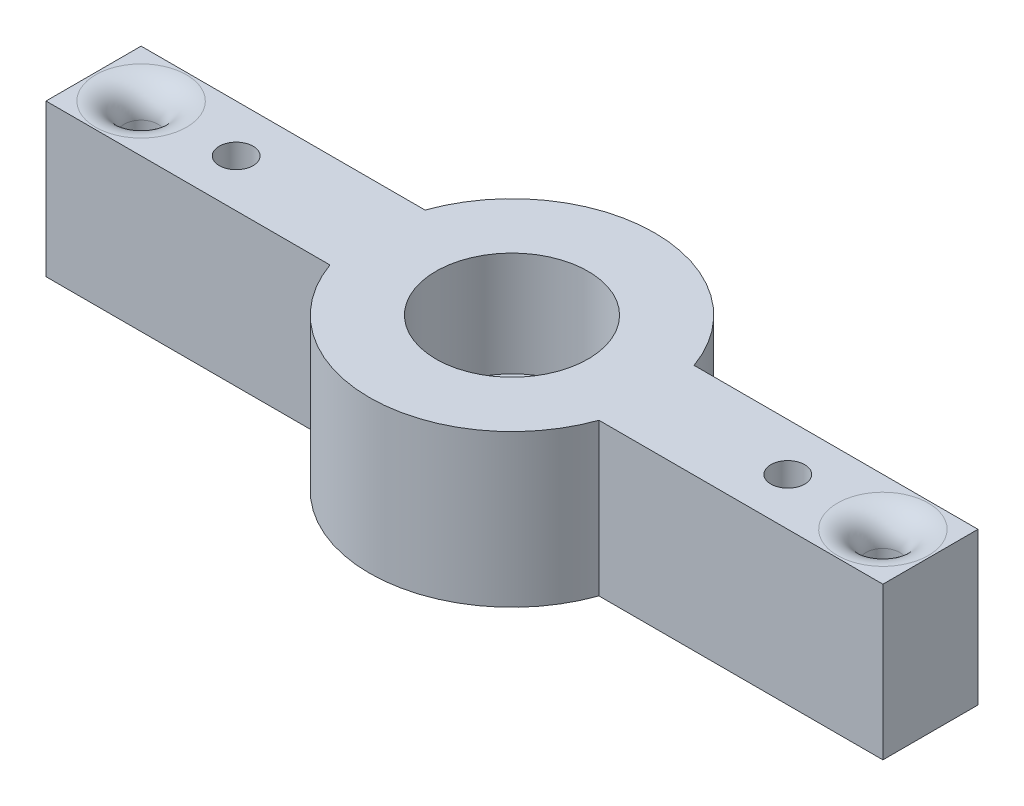
ISO-10303-21;
HEADER;
FILE_DESCRIPTION(('STEP AP214'),'2;1');
FILE_NAME('part.step','',(''),(''),'','','');
FILE_SCHEMA(('AUTOMOTIVE_DESIGN { 1 0 10303 214 1 1 1 1 }'));
ENDSEC;
DATA;
#1=APPLICATION_CONTEXT('core data for automotive mechanical design processes');
#2=APPLICATION_PROTOCOL_DEFINITION('international standard','automotive_design',2000,#1);
#3=PRODUCT_CONTEXT('',#1,'mechanical');
#4=PRODUCT('Part','Part','',(#3));
#5=PRODUCT_RELATED_PRODUCT_CATEGORY('part','',(#4));
#6=PRODUCT_DEFINITION_FORMATION('','',#4);
#7=PRODUCT_DEFINITION_CONTEXT('part definition',#1,'design');
#8=PRODUCT_DEFINITION('design','',#6,#7);
#9=PRODUCT_DEFINITION_SHAPE('','',#8);
#10=(LENGTH_UNIT() NAMED_UNIT(*) SI_UNIT(.MILLI.,.METRE.));
#11=(NAMED_UNIT(*) PLANE_ANGLE_UNIT() SI_UNIT($,.RADIAN.));
#12=(NAMED_UNIT(*) SI_UNIT($,.STERADIAN.) SOLID_ANGLE_UNIT());
#13=UNCERTAINTY_MEASURE_WITH_UNIT(LENGTH_MEASURE(1.E-05),#10,'distance_accuracy_value','');
#14=(GEOMETRIC_REPRESENTATION_CONTEXT(3) GLOBAL_UNCERTAINTY_ASSIGNED_CONTEXT((#13)) GLOBAL_UNIT_ASSIGNED_CONTEXT((#10,
#11,#12)) REPRESENTATION_CONTEXT('',''));
#15=CARTESIAN_POINT('',(0.,0.,0.));
#16=DIRECTION('',(0.,0.,1.));
#17=DIRECTION('',(1.,0.,0.));
#18=AXIS2_PLACEMENT_3D('',#15,#16,#17);
#19=CARTESIAN_POINT('',(0.,8.,0.));
#20=DIRECTION('',(0.,-1.,0.));
#21=DIRECTION('',(0.,0.,-1.));
#22=AXIS2_PLACEMENT_3D('',#19,#20,#21);
#23=CYLINDRICAL_SURFACE('',#22,1.875);
#24=CARTESIAN_POINT('',(0.,0.,0.));
#25=DIRECTION('',(0.,1.,0.));
#26=DIRECTION('',(0.,0.,1.));
#27=AXIS2_PLACEMENT_3D('',#24,#25,#26);
#28=CIRCLE('',#27,1.875);
#29=CARTESIAN_POINT('',(0.,0.,1.875));
#30=VERTEX_POINT('',#29);
#31=EDGE_CURVE('E207',#30,#30,#28,.T.);
#32=ORIENTED_EDGE('',*,*,#31,.F.);
#33=EDGE_LOOP('',(#32));
#34=FACE_BOUND('',#33,.T.);
#35=CARTESIAN_POINT('',(0.,2.5,0.));
#36=DIRECTION('',(0.,1.,0.));
#37=DIRECTION('',(0.,0.,1.));
#38=AXIS2_PLACEMENT_3D('',#35,#36,#37);
#39=CIRCLE('',#38,1.875);
#40=CARTESIAN_POINT('',(0.,2.5,1.875));
#41=VERTEX_POINT('',#40);
#42=EDGE_CURVE('E163',#41,#41,#39,.T.);
#43=ORIENTED_EDGE('',*,*,#42,.T.);
#44=EDGE_LOOP('',(#43));
#45=FACE_BOUND('',#44,.T.);
#46=ADVANCED_FACE('F33',(#34,#45),#23,.F.);
#47=CARTESIAN_POINT('',(0.,8.,0.));
#48=DIRECTION('',(0.,1.,0.));
#49=DIRECTION('',(0.,0.,1.));
#50=AXIS2_PLACEMENT_3D('',#47,#48,#49);
#51=PLANE('',#50);
#52=CARTESIAN_POINT('',(19.5,8.,0.));
#53=DIRECTION('',(0.,1.,0.));
#54=DIRECTION('',(0.,0.,1.));
#55=AXIS2_PLACEMENT_3D('',#52,#53,#54);
#56=CIRCLE('',#55,2.389);
#57=CARTESIAN_POINT('',(19.5,8.,2.389));
#58=VERTEX_POINT('',#57);
#59=EDGE_CURVE('E42',#58,#58,#56,.F.);
#60=ORIENTED_EDGE('',*,*,#59,.T.);
#61=EDGE_LOOP('',(#60));
#62=FACE_BOUND('',#61,.T.);
#63=CARTESIAN_POINT('',(-19.5,8.,0.));
#64=DIRECTION('',(0.,1.,0.));
#65=DIRECTION('',(0.,0.,1.));
#66=AXIS2_PLACEMENT_3D('',#63,#64,#65);
#67=CIRCLE('',#66,2.389);
#68=CARTESIAN_POINT('',(-19.5,8.,2.389));
#69=VERTEX_POINT('',#68);
#70=EDGE_CURVE('E170',#69,#69,#67,.F.);
#71=ORIENTED_EDGE('',*,*,#70,.T.);
#72=EDGE_LOOP('',(#71));
#73=FACE_BOUND('',#72,.T.);
#74=CARTESIAN_POINT('',(0.,8.,0.));
#75=DIRECTION('',(0.,1.,0.));
#76=DIRECTION('',(0.,0.,1.));
#77=AXIS2_PLACEMENT_3D('',#74,#75,#76);
#78=CIRCLE('',#77,4.);
#79=CARTESIAN_POINT('',(0.,8.,4.));
#80=VERTEX_POINT('',#79);
#81=EDGE_CURVE('E199',#80,#80,#78,.T.);
#82=ORIENTED_EDGE('',*,*,#81,.F.);
#83=EDGE_LOOP('',(#82));
#84=FACE_BOUND('',#83,.T.);
#85=CARTESIAN_POINT('',(14.5,8.,0.));
#86=DIRECTION('',(0.,1.,0.));
#87=DIRECTION('',(0.,0.,1.));
#88=AXIS2_PLACEMENT_3D('',#85,#86,#87);
#89=CIRCLE('',#88,0.889000000000002);
#90=CARTESIAN_POINT('',(14.5,8.,0.889000000000002));
#91=VERTEX_POINT('',#90);
#92=EDGE_CURVE('E195',#91,#91,#89,.T.);
#93=ORIENTED_EDGE('',*,*,#92,.F.);
#94=EDGE_LOOP('',(#93));
#95=FACE_BOUND('',#94,.T.);
#96=CARTESIAN_POINT('',(0.,8.,0.));
#97=DIRECTION('',(0.,1.,0.));
#98=DIRECTION('',(0.,0.,1.));
#99=AXIS2_PLACEMENT_3D('',#96,#97,#98);
#100=CIRCLE('',#99,7.5);
#101=CARTESIAN_POINT('',(-7.07106781186548,8.,2.5));
#102=VERTEX_POINT('',#101);
#103=CARTESIAN_POINT('',(7.07106781186548,8.,2.5));
#104=VERTEX_POINT('',#103);
#105=EDGE_CURVE('E147',#102,#104,#100,.T.);
#106=ORIENTED_EDGE('',*,*,#105,.T.);
#107=DIRECTION('',(1.,0.,0.));
#108=VECTOR('',#107,1.);
#109=CARTESIAN_POINT('',(22.,8.,2.5));
#110=LINE('',#109,#108);
#111=CARTESIAN_POINT('',(22.,8.,2.5));
#112=VERTEX_POINT('',#111);
#113=EDGE_CURVE('E94',#104,#112,#110,.T.);
#114=ORIENTED_EDGE('',*,*,#113,.T.);
#115=DIRECTION('',(0.,0.,-1.));
#116=VECTOR('',#115,1.);
#117=CARTESIAN_POINT('',(22.,8.,-2.5));
#118=LINE('',#117,#116);
#119=CARTESIAN_POINT('',(22.,8.,-2.5));
#120=VERTEX_POINT('',#119);
#121=EDGE_CURVE('E216',#112,#120,#118,.T.);
#122=ORIENTED_EDGE('',*,*,#121,.T.);
#123=DIRECTION('',(-1.,0.,0.));
#124=VECTOR('',#123,1.);
#125=CARTESIAN_POINT('',(7.07106781186548,8.,-2.5));
#126=LINE('',#125,#124);
#127=CARTESIAN_POINT('',(7.07106781186548,8.,-2.5));
#128=VERTEX_POINT('',#127);
#129=EDGE_CURVE('E218',#120,#128,#126,.T.);
#130=ORIENTED_EDGE('',*,*,#129,.T.);
#131=CARTESIAN_POINT('',(0.,8.,0.));
#132=DIRECTION('',(0.,1.,0.));
#133=DIRECTION('',(0.,0.,1.));
#134=AXIS2_PLACEMENT_3D('',#131,#132,#133);
#135=CIRCLE('',#134,7.5);
#136=CARTESIAN_POINT('',(-7.07106781186548,8.,-2.5));
#137=VERTEX_POINT('',#136);
#138=EDGE_CURVE('E114',#128,#137,#135,.T.);
#139=ORIENTED_EDGE('',*,*,#138,.T.);
#140=DIRECTION('',(-1.,0.,0.));
#141=VECTOR('',#140,1.);
#142=CARTESIAN_POINT('',(-7.07106781186548,8.,-2.5));
#143=LINE('',#142,#141);
#144=CARTESIAN_POINT('',(-22.,8.,-2.5));
#145=VERTEX_POINT('',#144);
#146=EDGE_CURVE('E107',#137,#145,#143,.T.);
#147=ORIENTED_EDGE('',*,*,#146,.T.);
#148=DIRECTION('',(0.,0.,1.));
#149=VECTOR('',#148,1.);
#150=CARTESIAN_POINT('',(-22.,8.,-2.5));
#151=LINE('',#150,#149);
#152=CARTESIAN_POINT('',(-22.,8.,2.5));
#153=VERTEX_POINT('',#152);
#154=EDGE_CURVE('E112',#145,#153,#151,.T.);
#155=ORIENTED_EDGE('',*,*,#154,.T.);
#156=DIRECTION('',(1.,0.,0.));
#157=VECTOR('',#156,1.);
#158=CARTESIAN_POINT('',(-22.,8.,2.5));
#159=LINE('',#158,#157);
#160=EDGE_CURVE('E50',#153,#102,#159,.T.);
#161=ORIENTED_EDGE('',*,*,#160,.T.);
#162=EDGE_LOOP('',(#106,#114,#122,#130,#139,#147,#155,#161));
#163=FACE_BOUND('',#162,.T.);
#164=CARTESIAN_POINT('',(-14.5,8.,0.));
#165=DIRECTION('',(0.,1.,0.));
#166=DIRECTION('',(0.,0.,1.));
#167=AXIS2_PLACEMENT_3D('',#164,#165,#166);
#168=CIRCLE('',#167,0.889000000000002);
#169=CARTESIAN_POINT('',(-14.5,8.,0.889000000000002));
#170=VERTEX_POINT('',#169);
#171=EDGE_CURVE('E204',#170,#170,#168,.T.);
#172=ORIENTED_EDGE('',*,*,#171,.F.);
#173=EDGE_LOOP('',(#172));
#174=FACE_BOUND('',#173,.T.);
#175=ADVANCED_FACE('F109',(#62,#73,#84,#95,#163,#174),#51,.T.);
#176=CARTESIAN_POINT('',(0.,0.,0.));
#177=DIRECTION('',(0.,1.,0.));
#178=DIRECTION('',(0.,0.,1.));
#179=AXIS2_PLACEMENT_3D('',#176,#177,#178);
#180=PLANE('',#179);
#181=CARTESIAN_POINT('',(14.5,0.,0.));
#182=DIRECTION('',(0.,1.,0.));
#183=DIRECTION('',(0.,0.,1.));
#184=AXIS2_PLACEMENT_3D('',#181,#182,#183);
#185=CIRCLE('',#184,0.889000000000002);
#186=CARTESIAN_POINT('',(14.5,0.,0.889000000000002));
#187=VERTEX_POINT('',#186);
#188=EDGE_CURVE('E192',#187,#187,#185,.T.);
#189=ORIENTED_EDGE('',*,*,#188,.T.);
#190=EDGE_LOOP('',(#189));
#191=FACE_BOUND('',#190,.T.);
#192=ORIENTED_EDGE('',*,*,#31,.T.);
#193=EDGE_LOOP('',(#192));
#194=FACE_BOUND('',#193,.T.);
#195=CARTESIAN_POINT('',(0.,0.,0.));
#196=DIRECTION('',(0.,1.,0.));
#197=DIRECTION('',(0.,0.,1.));
#198=AXIS2_PLACEMENT_3D('',#195,#196,#197);
#199=CIRCLE('',#198,7.5);
#200=CARTESIAN_POINT('',(-7.07106781186548,0.,2.5));
#201=VERTEX_POINT('',#200);
#202=CARTESIAN_POINT('',(7.07106781186548,0.,2.5));
#203=VERTEX_POINT('',#202);
#204=EDGE_CURVE('E132',#201,#203,#199,.T.);
#205=ORIENTED_EDGE('',*,*,#204,.F.);
#206=DIRECTION('',(1.,0.,0.));
#207=VECTOR('',#206,1.);
#208=CARTESIAN_POINT('',(-22.,0.,2.5));
#209=LINE('',#208,#207);
#210=CARTESIAN_POINT('',(-22.,0.,2.5));
#211=VERTEX_POINT('',#210);
#212=EDGE_CURVE('E85',#211,#201,#209,.T.);
#213=ORIENTED_EDGE('',*,*,#212,.F.);
#214=DIRECTION('',(0.,0.,1.));
#215=VECTOR('',#214,1.);
#216=CARTESIAN_POINT('',(-22.,0.,-2.5));
#217=LINE('',#216,#215);
#218=CARTESIAN_POINT('',(-22.,0.,-2.5));
#219=VERTEX_POINT('',#218);
#220=EDGE_CURVE('E79',#219,#211,#217,.T.);
#221=ORIENTED_EDGE('',*,*,#220,.F.);
#222=DIRECTION('',(-1.,0.,0.));
#223=VECTOR('',#222,1.);
#224=CARTESIAN_POINT('',(-7.07106781186548,0.,-2.5));
#225=LINE('',#224,#223);
#226=CARTESIAN_POINT('',(-7.07106781186548,0.,-2.5));
#227=VERTEX_POINT('',#226);
#228=EDGE_CURVE('E122',#227,#219,#225,.T.);
#229=ORIENTED_EDGE('',*,*,#228,.F.);
#230=CARTESIAN_POINT('',(0.,0.,0.));
#231=DIRECTION('',(0.,1.,0.));
#232=DIRECTION('',(0.,0.,1.));
#233=AXIS2_PLACEMENT_3D('',#230,#231,#232);
#234=CIRCLE('',#233,7.5);
#235=CARTESIAN_POINT('',(7.07106781186548,0.,-2.5));
#236=VERTEX_POINT('',#235);
#237=EDGE_CURVE('E142',#236,#227,#234,.T.);
#238=ORIENTED_EDGE('',*,*,#237,.F.);
#239=DIRECTION('',(-1.,0.,0.));
#240=VECTOR('',#239,1.);
#241=CARTESIAN_POINT('',(7.07106781186548,0.,-2.5));
#242=LINE('',#241,#240);
#243=CARTESIAN_POINT('',(22.,0.,-2.5));
#244=VERTEX_POINT('',#243);
#245=EDGE_CURVE('E140',#244,#236,#242,.T.);
#246=ORIENTED_EDGE('',*,*,#245,.F.);
#247=DIRECTION('',(0.,0.,-1.));
#248=VECTOR('',#247,1.);
#249=CARTESIAN_POINT('',(22.,0.,-2.5));
#250=LINE('',#249,#248);
#251=CARTESIAN_POINT('',(22.,0.,2.5));
#252=VERTEX_POINT('',#251);
#253=EDGE_CURVE('E138',#252,#244,#250,.T.);
#254=ORIENTED_EDGE('',*,*,#253,.F.);
#255=DIRECTION('',(1.,0.,0.));
#256=VECTOR('',#255,1.);
#257=CARTESIAN_POINT('',(22.,0.,2.5));
#258=LINE('',#257,#256);
#259=EDGE_CURVE('E135',#203,#252,#258,.T.);
#260=ORIENTED_EDGE('',*,*,#259,.F.);
#261=EDGE_LOOP('',(#205,#213,#221,#229,#238,#246,#254,#260));
#262=FACE_BOUND('',#261,.T.);
#263=CARTESIAN_POINT('',(-19.5,0.,0.));
#264=DIRECTION('',(0.,1.,0.));
#265=DIRECTION('',(0.,0.,1.));
#266=AXIS2_PLACEMENT_3D('',#263,#264,#265);
#267=CIRCLE('',#266,0.889);
#268=CARTESIAN_POINT('',(-19.5,0.,0.889));
#269=VERTEX_POINT('',#268);
#270=EDGE_CURVE('E136',#269,#269,#267,.T.);
#271=ORIENTED_EDGE('',*,*,#270,.T.);
#272=EDGE_LOOP('',(#271));
#273=FACE_BOUND('',#272,.T.);
#274=CARTESIAN_POINT('',(-14.5,0.,0.));
#275=DIRECTION('',(0.,1.,0.));
#276=DIRECTION('',(0.,0.,1.));
#277=AXIS2_PLACEMENT_3D('',#274,#275,#276);
#278=CIRCLE('',#277,0.889000000000002);
#279=CARTESIAN_POINT('',(-14.5,0.,0.889000000000002));
#280=VERTEX_POINT('',#279);
#281=EDGE_CURVE('E202',#280,#280,#278,.T.);
#282=ORIENTED_EDGE('',*,*,#281,.T.);
#283=EDGE_LOOP('',(#282));
#284=FACE_BOUND('',#283,.T.);
#285=CARTESIAN_POINT('',(19.5,0.,0.));
#286=DIRECTION('',(0.,1.,0.));
#287=DIRECTION('',(0.,0.,1.));
#288=AXIS2_PLACEMENT_3D('',#285,#286,#287);
#289=CIRCLE('',#288,0.889);
#290=CARTESIAN_POINT('',(19.5,0.,0.889));
#291=VERTEX_POINT('',#290);
#292=EDGE_CURVE('E166',#291,#291,#289,.T.);
#293=ORIENTED_EDGE('',*,*,#292,.T.);
#294=EDGE_LOOP('',(#293));
#295=FACE_BOUND('',#294,.T.);
#296=ADVANCED_FACE('F231',(#191,#194,#262,#273,#284,#295),#180,.F.);
#297=CARTESIAN_POINT('',(0.,8.,0.));
#298=DIRECTION('',(0.,-1.,0.));
#299=DIRECTION('',(0.,0.,-1.));
#300=AXIS2_PLACEMENT_3D('',#297,#298,#299);
#301=CYLINDRICAL_SURFACE('',#300,7.5);
#302=ORIENTED_EDGE('',*,*,#204,.T.);
#303=DIRECTION('',(0.,-1.,0.));
#304=VECTOR('',#303,1.);
#305=CARTESIAN_POINT('',(7.07106781186548,8.,2.5));
#306=LINE('',#305,#304);
#307=EDGE_CURVE('E160',#104,#203,#306,.T.);
#308=ORIENTED_EDGE('',*,*,#307,.F.);
#309=ORIENTED_EDGE('',*,*,#105,.F.);
#310=DIRECTION('',(0.,-1.,0.));
#311=VECTOR('',#310,1.);
#312=CARTESIAN_POINT('',(-7.07106781186548,8.,2.5));
#313=LINE('',#312,#311);
#314=EDGE_CURVE('E128',#102,#201,#313,.T.);
#315=ORIENTED_EDGE('',*,*,#314,.T.);
#316=EDGE_LOOP('',(#302,#308,#309,#315));
#317=FACE_BOUND('',#316,.T.);
#318=ADVANCED_FACE('F236',(#317),#301,.T.);
#319=CARTESIAN_POINT('',(22.,8.,2.5));
#320=DIRECTION('',(0.,0.,-1.));
#321=DIRECTION('',(-1.,0.,0.));
#322=AXIS2_PLACEMENT_3D('',#319,#320,#321);
#323=PLANE('',#322);
#324=ORIENTED_EDGE('',*,*,#259,.T.);
#325=DIRECTION('',(0.,-1.,0.));
#326=VECTOR('',#325,1.);
#327=CARTESIAN_POINT('',(22.,8.,2.5));
#328=LINE('',#327,#326);
#329=EDGE_CURVE('E157',#112,#252,#328,.T.);
#330=ORIENTED_EDGE('',*,*,#329,.F.);
#331=ORIENTED_EDGE('',*,*,#113,.F.);
#332=ORIENTED_EDGE('',*,*,#307,.T.);
#333=EDGE_LOOP('',(#324,#330,#331,#332));
#334=FACE_BOUND('',#333,.T.);
#335=ADVANCED_FACE('F269',(#334),#323,.F.);
#336=CARTESIAN_POINT('',(22.,8.,-2.5));
#337=DIRECTION('',(-1.,0.,0.));
#338=DIRECTION('',(0.,0.,1.));
#339=AXIS2_PLACEMENT_3D('',#336,#337,#338);
#340=PLANE('',#339);
#341=ORIENTED_EDGE('',*,*,#253,.T.);
#342=DIRECTION('',(0.,-1.,0.));
#343=VECTOR('',#342,1.);
#344=CARTESIAN_POINT('',(22.,8.,-2.5));
#345=LINE('',#344,#343);
#346=EDGE_CURVE('E154',#120,#244,#345,.T.);
#347=ORIENTED_EDGE('',*,*,#346,.F.);
#348=ORIENTED_EDGE('',*,*,#121,.F.);
#349=ORIENTED_EDGE('',*,*,#329,.T.);
#350=EDGE_LOOP('',(#341,#347,#348,#349));
#351=FACE_BOUND('',#350,.T.);
#352=ADVANCED_FACE('F373',(#351),#340,.F.);
#353=CARTESIAN_POINT('',(7.07106781186548,8.,-2.5));
#354=DIRECTION('',(0.,0.,1.));
#355=DIRECTION('',(1.,0.,0.));
#356=AXIS2_PLACEMENT_3D('',#353,#354,#355);
#357=PLANE('',#356);
#358=ORIENTED_EDGE('',*,*,#245,.T.);
#359=DIRECTION('',(0.,-1.,0.));
#360=VECTOR('',#359,1.);
#361=CARTESIAN_POINT('',(7.07106781186548,8.,-2.5));
#362=LINE('',#361,#360);
#363=EDGE_CURVE('E151',#128,#236,#362,.T.);
#364=ORIENTED_EDGE('',*,*,#363,.F.);
#365=ORIENTED_EDGE('',*,*,#129,.F.);
#366=ORIENTED_EDGE('',*,*,#346,.T.);
#367=EDGE_LOOP('',(#358,#364,#365,#366));
#368=FACE_BOUND('',#367,.T.);
#369=ADVANCED_FACE('F224',(#368),#357,.F.);
#370=CARTESIAN_POINT('',(0.,8.,0.));
#371=DIRECTION('',(0.,-1.,0.));
#372=DIRECTION('',(0.,0.,-1.));
#373=AXIS2_PLACEMENT_3D('',#370,#371,#372);
#374=CYLINDRICAL_SURFACE('',#373,7.5);
#375=ORIENTED_EDGE('',*,*,#237,.T.);
#376=DIRECTION('',(0.,-1.,0.));
#377=VECTOR('',#376,1.);
#378=CARTESIAN_POINT('',(-7.07106781186548,8.,-2.5));
#379=LINE('',#378,#377);
#380=EDGE_CURVE('E123',#137,#227,#379,.T.);
#381=ORIENTED_EDGE('',*,*,#380,.F.);
#382=ORIENTED_EDGE('',*,*,#138,.F.);
#383=ORIENTED_EDGE('',*,*,#363,.T.);
#384=EDGE_LOOP('',(#375,#381,#382,#383));
#385=FACE_BOUND('',#384,.T.);
#386=ADVANCED_FACE('F228',(#385),#374,.T.);
#387=CARTESIAN_POINT('',(-7.07106781186548,8.,-2.5));
#388=DIRECTION('',(0.,0.,1.));
#389=DIRECTION('',(1.,0.,0.));
#390=AXIS2_PLACEMENT_3D('',#387,#388,#389);
#391=PLANE('',#390);
#392=ORIENTED_EDGE('',*,*,#228,.T.);
#393=DIRECTION('',(0.,-1.,0.));
#394=VECTOR('',#393,1.);
#395=CARTESIAN_POINT('',(-22.,8.,-2.5));
#396=LINE('',#395,#394);
#397=EDGE_CURVE('E119',#145,#219,#396,.T.);
#398=ORIENTED_EDGE('',*,*,#397,.F.);
#399=ORIENTED_EDGE('',*,*,#146,.F.);
#400=ORIENTED_EDGE('',*,*,#380,.T.);
#401=EDGE_LOOP('',(#392,#398,#399,#400));
#402=FACE_BOUND('',#401,.T.);
#403=ADVANCED_FACE('F120',(#402),#391,.F.);
#404=CARTESIAN_POINT('',(-22.,8.,-2.5));
#405=DIRECTION('',(1.,0.,0.));
#406=DIRECTION('',(0.,0.,-1.));
#407=AXIS2_PLACEMENT_3D('',#404,#405,#406);
#408=PLANE('',#407);
#409=ORIENTED_EDGE('',*,*,#220,.T.);
#410=DIRECTION('',(0.,-1.,0.));
#411=VECTOR('',#410,1.);
#412=CARTESIAN_POINT('',(-22.,8.,2.5));
#413=LINE('',#412,#411);
#414=EDGE_CURVE('E124',#153,#211,#413,.T.);
#415=ORIENTED_EDGE('',*,*,#414,.F.);
#416=ORIENTED_EDGE('',*,*,#154,.F.);
#417=ORIENTED_EDGE('',*,*,#397,.T.);
#418=EDGE_LOOP('',(#409,#415,#416,#417));
#419=FACE_BOUND('',#418,.T.);
#420=ADVANCED_FACE('F126',(#419),#408,.F.);
#421=CARTESIAN_POINT('',(-22.,8.,2.5));
#422=DIRECTION('',(0.,0.,-1.));
#423=DIRECTION('',(-1.,0.,0.));
#424=AXIS2_PLACEMENT_3D('',#421,#422,#423);
#425=PLANE('',#424);
#426=ORIENTED_EDGE('',*,*,#212,.T.);
#427=ORIENTED_EDGE('',*,*,#314,.F.);
#428=ORIENTED_EDGE('',*,*,#160,.F.);
#429=ORIENTED_EDGE('',*,*,#414,.T.);
#430=EDGE_LOOP('',(#426,#427,#428,#429));
#431=FACE_BOUND('',#430,.T.);
#432=ADVANCED_FACE('F238',(#431),#425,.F.);
#433=CARTESIAN_POINT('',(-19.5,8.,0.));
#434=DIRECTION('',(0.,-1.,0.));
#435=DIRECTION('',(0.,0.,-1.));
#436=AXIS2_PLACEMENT_3D('',#433,#434,#435);
#437=CYLINDRICAL_SURFACE('',#436,0.889);
#438=CARTESIAN_POINT('',(-19.5,6.5,0.));
#439=DIRECTION('',(0.,1.,0.));
#440=DIRECTION('',(0.,0.,1.));
#441=AXIS2_PLACEMENT_3D('',#438,#439,#440);
#442=CIRCLE('',#441,0.889);
#443=CARTESIAN_POINT('',(-19.5,6.5,0.889));
#444=VERTEX_POINT('',#443);
#445=EDGE_CURVE('E11',#444,#444,#442,.T.);
#446=ORIENTED_EDGE('',*,*,#445,.T.);
#447=EDGE_LOOP('',(#446));
#448=FACE_BOUND('',#447,.T.);
#449=ORIENTED_EDGE('',*,*,#270,.F.);
#450=EDGE_LOOP('',(#449));
#451=FACE_BOUND('',#450,.T.);
#452=ADVANCED_FACE('F240',(#448,#451),#437,.F.);
#453=CARTESIAN_POINT('',(-14.5,8.,0.));
#454=DIRECTION('',(0.,-1.,0.));
#455=DIRECTION('',(0.,0.,-1.));
#456=AXIS2_PLACEMENT_3D('',#453,#454,#455);
#457=CYLINDRICAL_SURFACE('',#456,0.889000000000002);
#458=ORIENTED_EDGE('',*,*,#171,.T.);
#459=EDGE_LOOP('',(#458));
#460=FACE_BOUND('',#459,.T.);
#461=ORIENTED_EDGE('',*,*,#281,.F.);
#462=EDGE_LOOP('',(#461));
#463=FACE_BOUND('',#462,.T.);
#464=ADVANCED_FACE('F247',(#460,#463),#457,.F.);
#465=CARTESIAN_POINT('',(14.5,8.,0.));
#466=DIRECTION('',(0.,-1.,0.));
#467=DIRECTION('',(0.,0.,-1.));
#468=AXIS2_PLACEMENT_3D('',#465,#466,#467);
#469=CYLINDRICAL_SURFACE('',#468,0.889000000000002);
#470=ORIENTED_EDGE('',*,*,#92,.T.);
#471=EDGE_LOOP('',(#470));
#472=FACE_BOUND('',#471,.T.);
#473=ORIENTED_EDGE('',*,*,#188,.F.);
#474=EDGE_LOOP('',(#473));
#475=FACE_BOUND('',#474,.T.);
#476=ADVANCED_FACE('F187',(#472,#475),#469,.F.);
#477=CARTESIAN_POINT('',(19.5,8.,0.));
#478=DIRECTION('',(0.,-1.,0.));
#479=DIRECTION('',(0.,0.,-1.));
#480=AXIS2_PLACEMENT_3D('',#477,#478,#479);
#481=CYLINDRICAL_SURFACE('',#480,0.889);
#482=CARTESIAN_POINT('',(19.5,6.5,0.));
#483=DIRECTION('',(0.,1.,0.));
#484=DIRECTION('',(0.,0.,1.));
#485=AXIS2_PLACEMENT_3D('',#482,#483,#484);
#486=CIRCLE('',#485,0.889);
#487=CARTESIAN_POINT('',(19.5,6.5,0.889));
#488=VERTEX_POINT('',#487);
#489=EDGE_CURVE('E162',#488,#488,#486,.T.);
#490=ORIENTED_EDGE('',*,*,#489,.T.);
#491=EDGE_LOOP('',(#490));
#492=FACE_BOUND('',#491,.T.);
#493=ORIENTED_EDGE('',*,*,#292,.F.);
#494=EDGE_LOOP('',(#493));
#495=FACE_BOUND('',#494,.T.);
#496=ADVANCED_FACE('F183',(#492,#495),#481,.F.);
#497=CARTESIAN_POINT('',(0.,2.5,0.));
#498=DIRECTION('',(0.,1.,0.));
#499=DIRECTION('',(0.,0.,1.));
#500=AXIS2_PLACEMENT_3D('',#497,#498,#499);
#501=CYLINDRICAL_SURFACE('',#500,4.);
#502=CARTESIAN_POINT('',(0.,2.5,0.));
#503=DIRECTION('',(0.,1.,0.));
#504=DIRECTION('',(0.,0.,1.));
#505=AXIS2_PLACEMENT_3D('',#502,#503,#504);
#506=CIRCLE('',#505,4.);
#507=CARTESIAN_POINT('',(0.,2.5,4.));
#508=VERTEX_POINT('',#507);
#509=EDGE_CURVE('E167',#508,#508,#506,.T.);
#510=ORIENTED_EDGE('',*,*,#509,.F.);
#511=EDGE_LOOP('',(#510));
#512=FACE_BOUND('',#511,.T.);
#513=ORIENTED_EDGE('',*,*,#81,.T.);
#514=EDGE_LOOP('',(#513));
#515=FACE_BOUND('',#514,.T.);
#516=ADVANCED_FACE('F186',(#512,#515),#501,.F.);
#517=CARTESIAN_POINT('',(0.,2.5,0.));
#518=DIRECTION('',(0.,1.,0.));
#519=DIRECTION('',(0.,0.,1.));
#520=AXIS2_PLACEMENT_3D('',#517,#518,#519);
#521=PLANE('',#520);
#522=ORIENTED_EDGE('',*,*,#42,.F.);
#523=EDGE_LOOP('',(#522));
#524=FACE_BOUND('',#523,.T.);
#525=ORIENTED_EDGE('',*,*,#509,.T.);
#526=EDGE_LOOP('',(#525));
#527=FACE_BOUND('',#526,.T.);
#528=ADVANCED_FACE('F180',(#524,#527),#521,.T.);
#529=CARTESIAN_POINT('',(19.5,6.5,0.));
#530=DIRECTION('',(0.,1.,0.));
#531=DIRECTION('',(0.,0.,1.));
#532=AXIS2_PLACEMENT_3D('',#529,#530,#531);
#533=TOROIDAL_SURFACE('',#532,2.389,1.5);
#534=ORIENTED_EDGE('',*,*,#59,.F.);
#535=EDGE_LOOP('',(#534));
#536=FACE_BOUND('',#535,.T.);
#537=ORIENTED_EDGE('',*,*,#489,.F.);
#538=EDGE_LOOP('',(#537));
#539=FACE_BOUND('',#538,.T.);
#540=ADVANCED_FACE('F177',(#536,#539),#533,.T.);
#541=CARTESIAN_POINT('',(-19.5,6.5,0.));
#542=DIRECTION('',(0.,1.,0.));
#543=DIRECTION('',(0.,0.,1.));
#544=AXIS2_PLACEMENT_3D('',#541,#542,#543);
#545=TOROIDAL_SURFACE('',#544,2.389,1.5);
#546=ORIENTED_EDGE('',*,*,#70,.F.);
#547=EDGE_LOOP('',(#546));
#548=FACE_BOUND('',#547,.T.);
#549=ORIENTED_EDGE('',*,*,#445,.F.);
#550=EDGE_LOOP('',(#549));
#551=FACE_BOUND('',#550,.T.);
#552=ADVANCED_FACE('F35',(#548,#551),#545,.T.);
#553=CLOSED_SHELL('',(#46,#175,#296,#318,#335,#352,#369,#386,#403,#420,#432,#452,#464,#476,#496,
#516,#528,#540,#552));
#554=MANIFOLD_SOLID_BREP('B2',#553);
#555=ADVANCED_BREP_SHAPE_REPRESENTATION('',(#18,#554),#14);
#556=SHAPE_DEFINITION_REPRESENTATION(#9,#555);
ENDSEC;
END-ISO-10303-21;
